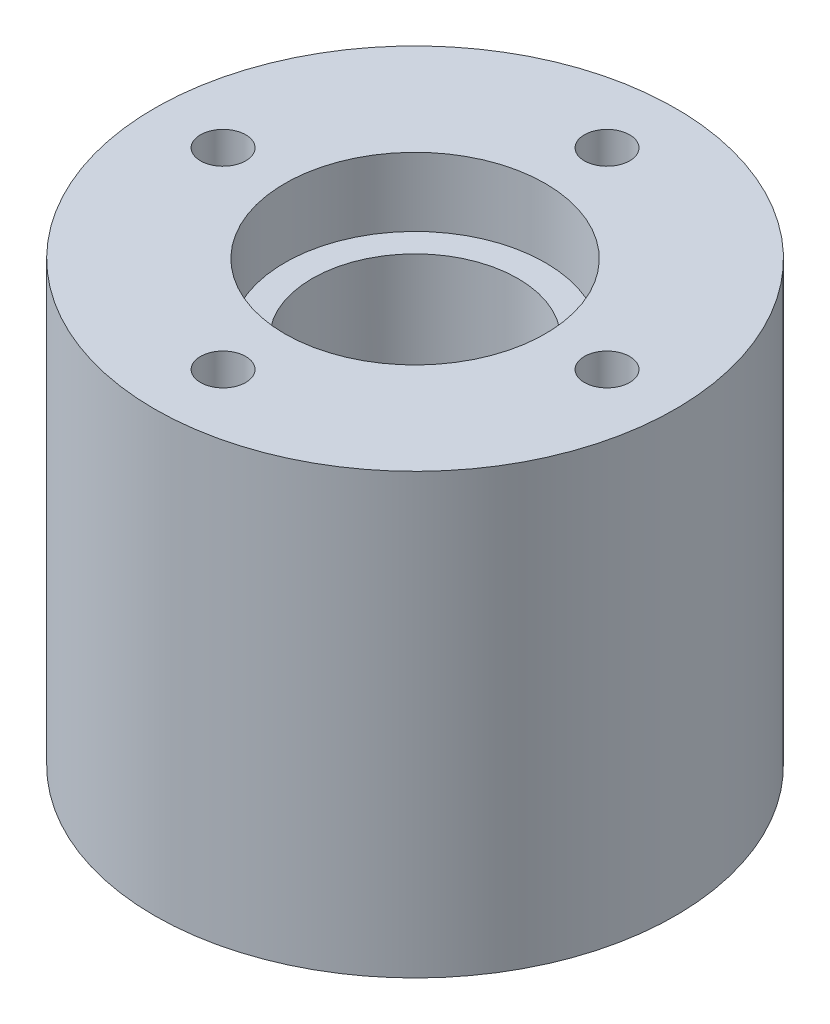
ISO-10303-21;
HEADER;
FILE_DESCRIPTION(('STEP AP214'),'2;1');
FILE_NAME('part.step','',(''),(''),'','','');
FILE_SCHEMA(('AUTOMOTIVE_DESIGN { 1 0 10303 214 1 1 1 1 }'));
ENDSEC;
DATA;
#1=APPLICATION_CONTEXT('core data for automotive mechanical design processes');
#2=APPLICATION_PROTOCOL_DEFINITION('international standard','automotive_design',2000,#1);
#3=PRODUCT_CONTEXT('',#1,'mechanical');
#4=PRODUCT('Part','Part','',(#3));
#5=PRODUCT_RELATED_PRODUCT_CATEGORY('part','',(#4));
#6=PRODUCT_DEFINITION_FORMATION('','',#4);
#7=PRODUCT_DEFINITION_CONTEXT('part definition',#1,'design');
#8=PRODUCT_DEFINITION('design','',#6,#7);
#9=PRODUCT_DEFINITION_SHAPE('','',#8);
#10=(LENGTH_UNIT() NAMED_UNIT(*) SI_UNIT(.MILLI.,.METRE.));
#11=(NAMED_UNIT(*) PLANE_ANGLE_UNIT() SI_UNIT($,.RADIAN.));
#12=(NAMED_UNIT(*) SI_UNIT($,.STERADIAN.) SOLID_ANGLE_UNIT());
#13=UNCERTAINTY_MEASURE_WITH_UNIT(LENGTH_MEASURE(1.E-05),#10,'distance_accuracy_value','');
#14=(GEOMETRIC_REPRESENTATION_CONTEXT(3) GLOBAL_UNCERTAINTY_ASSIGNED_CONTEXT((#13)) GLOBAL_UNIT_ASSIGNED_CONTEXT((#10,
#11,#12)) REPRESENTATION_CONTEXT('',''));
#15=CARTESIAN_POINT('',(0.,0.,0.));
#16=DIRECTION('',(0.,0.,1.));
#17=DIRECTION('',(1.,0.,0.));
#18=AXIS2_PLACEMENT_3D('',#15,#16,#17);
#19=CARTESIAN_POINT('',(0.,32.,0.));
#20=DIRECTION('',(0.,-1.,0.));
#21=DIRECTION('',(0.,0.,-1.));
#22=AXIS2_PLACEMENT_3D('',#19,#20,#21);
#23=CYLINDRICAL_SURFACE('',#22,7.5);
#24=CARTESIAN_POINT('',(0.,27.,0.));
#25=DIRECTION('',(0.,1.,0.));
#26=DIRECTION('',(0.,0.,1.));
#27=AXIS2_PLACEMENT_3D('',#24,#25,#26);
#28=CIRCLE('',#27,7.5);
#29=CARTESIAN_POINT('',(0.,27.,7.5));
#30=VERTEX_POINT('',#29);
#31=EDGE_CURVE('E137',#30,#30,#28,.T.);
#32=ORIENTED_EDGE('',*,*,#31,.T.);
#33=EDGE_LOOP('',(#32));
#34=FACE_BOUND('',#33,.T.);
#35=CARTESIAN_POINT('',(0.,5.,0.));
#36=DIRECTION('',(0.,-1.,0.));
#37=DIRECTION('',(0.,0.,-1.));
#38=AXIS2_PLACEMENT_3D('',#35,#36,#37);
#39=CIRCLE('',#38,7.5);
#40=CARTESIAN_POINT('',(0.,5.,-7.5));
#41=VERTEX_POINT('',#40);
#42=EDGE_CURVE('E40',#41,#41,#39,.T.);
#43=ORIENTED_EDGE('',*,*,#42,.T.);
#44=EDGE_LOOP('',(#43));
#45=FACE_BOUND('',#44,.T.);
#46=ADVANCED_FACE('F36',(#34,#45),#23,.F.);
#47=CARTESIAN_POINT('',(0.,32.,0.));
#48=DIRECTION('',(0.,1.,0.));
#49=DIRECTION('',(0.,0.,1.));
#50=AXIS2_PLACEMENT_3D('',#47,#48,#49);
#51=PLANE('',#50);
#52=CARTESIAN_POINT('',(14.,32.,0.));
#53=DIRECTION('',(0.,1.,0.));
#54=DIRECTION('',(0.,0.,1.));
#55=AXIS2_PLACEMENT_3D('',#52,#53,#54);
#56=CIRCLE('',#55,1.64999999999999);
#57=CARTESIAN_POINT('',(14.,32.,1.64999999999999));
#58=VERTEX_POINT('',#57);
#59=EDGE_CURVE('E82',#58,#58,#56,.T.);
#60=ORIENTED_EDGE('',*,*,#59,.F.);
#61=EDGE_LOOP('',(#60));
#62=FACE_BOUND('',#61,.T.);
#63=CARTESIAN_POINT('',(0.,32.,14.));
#64=DIRECTION('',(0.,1.,0.));
#65=DIRECTION('',(0.,0.,1.));
#66=AXIS2_PLACEMENT_3D('',#63,#64,#65);
#67=CIRCLE('',#66,1.64999999999999);
#68=CARTESIAN_POINT('',(0.,32.,15.65));
#69=VERTEX_POINT('',#68);
#70=EDGE_CURVE('E81',#69,#69,#67,.T.);
#71=ORIENTED_EDGE('',*,*,#70,.F.);
#72=EDGE_LOOP('',(#71));
#73=FACE_BOUND('',#72,.T.);
#74=CARTESIAN_POINT('',(-14.,32.,0.));
#75=DIRECTION('',(0.,1.,0.));
#76=DIRECTION('',(0.,0.,1.));
#77=AXIS2_PLACEMENT_3D('',#74,#75,#76);
#78=CIRCLE('',#77,1.64999999999999);
#79=CARTESIAN_POINT('',(-14.,32.,1.64999999999999));
#80=VERTEX_POINT('',#79);
#81=EDGE_CURVE('E92',#80,#80,#78,.T.);
#82=ORIENTED_EDGE('',*,*,#81,.F.);
#83=EDGE_LOOP('',(#82));
#84=FACE_BOUND('',#83,.T.);
#85=CARTESIAN_POINT('',(0.,32.,-14.));
#86=DIRECTION('',(0.,1.,0.));
#87=DIRECTION('',(0.,0.,1.));
#88=AXIS2_PLACEMENT_3D('',#85,#86,#87);
#89=CIRCLE('',#88,1.64999999999999);
#90=CARTESIAN_POINT('',(0.,32.,-12.35));
#91=VERTEX_POINT('',#90);
#92=EDGE_CURVE('E98',#91,#91,#89,.T.);
#93=ORIENTED_EDGE('',*,*,#92,.F.);
#94=EDGE_LOOP('',(#93));
#95=FACE_BOUND('',#94,.T.);
#96=CARTESIAN_POINT('',(0.,32.,0.));
#97=DIRECTION('',(0.,1.,0.));
#98=DIRECTION('',(0.,0.,1.));
#99=AXIS2_PLACEMENT_3D('',#96,#97,#98);
#100=CIRCLE('',#99,9.5);
#101=CARTESIAN_POINT('',(0.,32.,9.5));
#102=VERTEX_POINT('',#101);
#103=EDGE_CURVE('E138',#102,#102,#100,.T.);
#104=ORIENTED_EDGE('',*,*,#103,.F.);
#105=EDGE_LOOP('',(#104));
#106=FACE_BOUND('',#105,.T.);
#107=CARTESIAN_POINT('',(0.,32.,0.));
#108=DIRECTION('',(0.,1.,0.));
#109=DIRECTION('',(0.,0.,1.));
#110=AXIS2_PLACEMENT_3D('',#107,#108,#109);
#111=CIRCLE('',#110,19.);
#112=CARTESIAN_POINT('',(0.,32.,19.));
#113=VERTEX_POINT('',#112);
#114=EDGE_CURVE('E11',#113,#113,#111,.T.);
#115=ORIENTED_EDGE('',*,*,#114,.T.);
#116=EDGE_LOOP('',(#115));
#117=FACE_BOUND('',#116,.T.);
#118=ADVANCED_FACE('F160',(#62,#73,#84,#95,#106,#117),#51,.T.);
#119=CARTESIAN_POINT('',(0.,0.,0.));
#120=DIRECTION('',(0.,1.,0.));
#121=DIRECTION('',(0.,0.,1.));
#122=AXIS2_PLACEMENT_3D('',#119,#120,#121);
#123=PLANE('',#122);
#124=CARTESIAN_POINT('',(0.,0.,-14.));
#125=DIRECTION('',(0.,-1.,0.));
#126=DIRECTION('',(0.,0.,-1.));
#127=AXIS2_PLACEMENT_3D('',#124,#125,#126);
#128=CIRCLE('',#127,1.65);
#129=CARTESIAN_POINT('',(0.,0.,-15.65));
#130=VERTEX_POINT('',#129);
#131=EDGE_CURVE('E104',#130,#130,#128,.T.);
#132=ORIENTED_EDGE('',*,*,#131,.F.);
#133=EDGE_LOOP('',(#132));
#134=FACE_BOUND('',#133,.T.);
#135=CARTESIAN_POINT('',(-14.,0.,0.));
#136=DIRECTION('',(0.,-1.,0.));
#137=DIRECTION('',(0.,0.,-1.));
#138=AXIS2_PLACEMENT_3D('',#135,#136,#137);
#139=CIRCLE('',#138,1.65);
#140=CARTESIAN_POINT('',(-14.,0.,-1.65));
#141=VERTEX_POINT('',#140);
#142=EDGE_CURVE('E110',#141,#141,#139,.T.);
#143=ORIENTED_EDGE('',*,*,#142,.F.);
#144=EDGE_LOOP('',(#143));
#145=FACE_BOUND('',#144,.T.);
#146=CARTESIAN_POINT('',(0.,0.,14.));
#147=DIRECTION('',(0.,-1.,0.));
#148=DIRECTION('',(0.,0.,-1.));
#149=AXIS2_PLACEMENT_3D('',#146,#147,#148);
#150=CIRCLE('',#149,1.65);
#151=CARTESIAN_POINT('',(0.,0.,12.35));
#152=VERTEX_POINT('',#151);
#153=EDGE_CURVE('E116',#152,#152,#150,.T.);
#154=ORIENTED_EDGE('',*,*,#153,.F.);
#155=EDGE_LOOP('',(#154));
#156=FACE_BOUND('',#155,.T.);
#157=CARTESIAN_POINT('',(14.,0.,0.));
#158=DIRECTION('',(0.,-1.,0.));
#159=DIRECTION('',(0.,0.,-1.));
#160=AXIS2_PLACEMENT_3D('',#157,#158,#159);
#161=CIRCLE('',#160,1.65);
#162=CARTESIAN_POINT('',(14.,0.,-1.65));
#163=VERTEX_POINT('',#162);
#164=EDGE_CURVE('E122',#163,#163,#161,.T.);
#165=ORIENTED_EDGE('',*,*,#164,.F.);
#166=EDGE_LOOP('',(#165));
#167=FACE_BOUND('',#166,.T.);
#168=CARTESIAN_POINT('',(0.,0.,0.));
#169=DIRECTION('',(0.,-1.,0.));
#170=DIRECTION('',(0.,0.,-1.));
#171=AXIS2_PLACEMENT_3D('',#168,#169,#170);
#172=CIRCLE('',#171,9.5);
#173=CARTESIAN_POINT('',(0.,0.,-9.5));
#174=VERTEX_POINT('',#173);
#175=EDGE_CURVE('E128',#174,#174,#172,.T.);
#176=ORIENTED_EDGE('',*,*,#175,.F.);
#177=EDGE_LOOP('',(#176));
#178=FACE_BOUND('',#177,.T.);
#179=CARTESIAN_POINT('',(0.,0.,0.));
#180=DIRECTION('',(0.,1.,0.));
#181=DIRECTION('',(0.,0.,1.));
#182=AXIS2_PLACEMENT_3D('',#179,#180,#181);
#183=CIRCLE('',#182,19.);
#184=CARTESIAN_POINT('',(0.,0.,19.));
#185=VERTEX_POINT('',#184);
#186=EDGE_CURVE('E45',#185,#185,#183,.T.);
#187=ORIENTED_EDGE('',*,*,#186,.F.);
#188=EDGE_LOOP('',(#187));
#189=FACE_BOUND('',#188,.T.);
#190=ADVANCED_FACE('F163',(#134,#145,#156,#167,#178,#189),#123,.F.);
#191=CARTESIAN_POINT('',(0.,32.,0.));
#192=DIRECTION('',(0.,-1.,0.));
#193=DIRECTION('',(0.,0.,-1.));
#194=AXIS2_PLACEMENT_3D('',#191,#192,#193);
#195=CYLINDRICAL_SURFACE('',#194,19.);
#196=ORIENTED_EDGE('',*,*,#114,.F.);
#197=EDGE_LOOP('',(#196));
#198=FACE_BOUND('',#197,.T.);
#199=ORIENTED_EDGE('',*,*,#186,.T.);
#200=EDGE_LOOP('',(#199));
#201=FACE_BOUND('',#200,.T.);
#202=ADVANCED_FACE('F38',(#198,#201),#195,.T.);
#203=CARTESIAN_POINT('',(0.,27.,0.));
#204=DIRECTION('',(0.,1.,0.));
#205=DIRECTION('',(0.,0.,1.));
#206=AXIS2_PLACEMENT_3D('',#203,#204,#205);
#207=CYLINDRICAL_SURFACE('',#206,9.5);
#208=CARTESIAN_POINT('',(0.,27.,0.));
#209=DIRECTION('',(0.,1.,0.));
#210=DIRECTION('',(0.,0.,1.));
#211=AXIS2_PLACEMENT_3D('',#208,#209,#210);
#212=CIRCLE('',#211,9.5);
#213=CARTESIAN_POINT('',(0.,27.,9.5));
#214=VERTEX_POINT('',#213);
#215=EDGE_CURVE('E134',#214,#214,#212,.T.);
#216=ORIENTED_EDGE('',*,*,#215,.F.);
#217=EDGE_LOOP('',(#216));
#218=FACE_BOUND('',#217,.T.);
#219=ORIENTED_EDGE('',*,*,#103,.T.);
#220=EDGE_LOOP('',(#219));
#221=FACE_BOUND('',#220,.T.);
#222=ADVANCED_FACE('F151',(#218,#221),#207,.F.);
#223=CARTESIAN_POINT('',(0.,27.,0.));
#224=DIRECTION('',(0.,1.,0.));
#225=DIRECTION('',(0.,0.,1.));
#226=AXIS2_PLACEMENT_3D('',#223,#224,#225);
#227=PLANE('',#226);
#228=ORIENTED_EDGE('',*,*,#31,.F.);
#229=EDGE_LOOP('',(#228));
#230=FACE_BOUND('',#229,.T.);
#231=ORIENTED_EDGE('',*,*,#215,.T.);
#232=EDGE_LOOP('',(#231));
#233=FACE_BOUND('',#232,.T.);
#234=ADVANCED_FACE('F147',(#230,#233),#227,.T.);
#235=CARTESIAN_POINT('',(0.,5.,0.));
#236=DIRECTION('',(0.,-1.,0.));
#237=DIRECTION('',(0.,0.,-1.));
#238=AXIS2_PLACEMENT_3D('',#235,#236,#237);
#239=CYLINDRICAL_SURFACE('',#238,9.5);
#240=CARTESIAN_POINT('',(0.,5.,0.));
#241=DIRECTION('',(0.,-1.,0.));
#242=DIRECTION('',(0.,0.,-1.));
#243=AXIS2_PLACEMENT_3D('',#240,#241,#242);
#244=CIRCLE('',#243,9.5);
#245=CARTESIAN_POINT('',(0.,5.,-9.5));
#246=VERTEX_POINT('',#245);
#247=EDGE_CURVE('E129',#246,#246,#244,.T.);
#248=ORIENTED_EDGE('',*,*,#247,.F.);
#249=EDGE_LOOP('',(#248));
#250=FACE_BOUND('',#249,.T.);
#251=ORIENTED_EDGE('',*,*,#175,.T.);
#252=EDGE_LOOP('',(#251));
#253=FACE_BOUND('',#252,.T.);
#254=ADVANCED_FACE('F150',(#250,#253),#239,.F.);
#255=CARTESIAN_POINT('',(0.,5.,0.));
#256=DIRECTION('',(0.,-1.,0.));
#257=DIRECTION('',(0.,0.,-1.));
#258=AXIS2_PLACEMENT_3D('',#255,#256,#257);
#259=PLANE('',#258);
#260=ORIENTED_EDGE('',*,*,#42,.F.);
#261=EDGE_LOOP('',(#260));
#262=FACE_BOUND('',#261,.T.);
#263=ORIENTED_EDGE('',*,*,#247,.T.);
#264=EDGE_LOOP('',(#263));
#265=FACE_BOUND('',#264,.T.);
#266=ADVANCED_FACE('F188',(#262,#265),#259,.T.);
#267=CARTESIAN_POINT('',(14.,10.1,0.));
#268=DIRECTION('',(0.,-1.,0.));
#269=DIRECTION('',(0.,0.,-1.));
#270=AXIS2_PLACEMENT_3D('',#267,#268,#269);
#271=CONICAL_SURFACE('',#270,1.65,1.02974425867665);
#272=CARTESIAN_POINT('',(14.,11.0914200213955,0.));
#273=VERTEX_POINT('',#272);
#274=VERTEX_LOOP('',#273);
#275=FACE_BOUND('',#274,.T.);
#276=CARTESIAN_POINT('',(14.,10.1,0.));
#277=DIRECTION('',(0.,-1.,0.));
#278=DIRECTION('',(0.,0.,-1.));
#279=AXIS2_PLACEMENT_3D('',#276,#277,#278);
#280=CIRCLE('',#279,1.65);
#281=CARTESIAN_POINT('',(14.,10.1,-1.65));
#282=VERTEX_POINT('',#281);
#283=EDGE_CURVE('E125',#282,#282,#280,.T.);
#284=ORIENTED_EDGE('',*,*,#283,.T.);
#285=EDGE_LOOP('',(#284));
#286=FACE_BOUND('',#285,.T.);
#287=ADVANCED_FACE('F192',(#275,#286),#271,.F.);
#288=CARTESIAN_POINT('',(14.,0.,0.));
#289=DIRECTION('',(0.,-1.,0.));
#290=DIRECTION('',(0.,0.,-1.));
#291=AXIS2_PLACEMENT_3D('',#288,#289,#290);
#292=CYLINDRICAL_SURFACE('',#291,1.65);
#293=ORIENTED_EDGE('',*,*,#283,.F.);
#294=EDGE_LOOP('',(#293));
#295=FACE_BOUND('',#294,.T.);
#296=ORIENTED_EDGE('',*,*,#164,.T.);
#297=EDGE_LOOP('',(#296));
#298=FACE_BOUND('',#297,.T.);
#299=ADVANCED_FACE('F196',(#295,#298),#292,.F.);
#300=CARTESIAN_POINT('',(0.,10.1,14.));
#301=DIRECTION('',(0.,-1.,0.));
#302=DIRECTION('',(0.,0.,-1.));
#303=AXIS2_PLACEMENT_3D('',#300,#301,#302);
#304=CONICAL_SURFACE('',#303,1.65,1.02974425867665);
#305=CARTESIAN_POINT('',(0.,11.0914200213955,14.));
#306=VERTEX_POINT('',#305);
#307=VERTEX_LOOP('',#306);
#308=FACE_BOUND('',#307,.T.);
#309=CARTESIAN_POINT('',(0.,10.1,14.));
#310=DIRECTION('',(0.,-1.,0.));
#311=DIRECTION('',(0.,0.,-1.));
#312=AXIS2_PLACEMENT_3D('',#309,#310,#311);
#313=CIRCLE('',#312,1.65);
#314=CARTESIAN_POINT('',(0.,10.1,12.35));
#315=VERTEX_POINT('',#314);
#316=EDGE_CURVE('E119',#315,#315,#313,.T.);
#317=ORIENTED_EDGE('',*,*,#316,.T.);
#318=EDGE_LOOP('',(#317));
#319=FACE_BOUND('',#318,.T.);
#320=ADVANCED_FACE('F199',(#308,#319),#304,.F.);
#321=CARTESIAN_POINT('',(0.,0.,14.));
#322=DIRECTION('',(0.,-1.,0.));
#323=DIRECTION('',(0.,0.,-1.));
#324=AXIS2_PLACEMENT_3D('',#321,#322,#323);
#325=CYLINDRICAL_SURFACE('',#324,1.65);
#326=ORIENTED_EDGE('',*,*,#316,.F.);
#327=EDGE_LOOP('',(#326));
#328=FACE_BOUND('',#327,.T.);
#329=ORIENTED_EDGE('',*,*,#153,.T.);
#330=EDGE_LOOP('',(#329));
#331=FACE_BOUND('',#330,.T.);
#332=ADVANCED_FACE('F203',(#328,#331),#325,.F.);
#333=CARTESIAN_POINT('',(-14.,10.1,0.));
#334=DIRECTION('',(0.,-1.,0.));
#335=DIRECTION('',(0.,0.,-1.));
#336=AXIS2_PLACEMENT_3D('',#333,#334,#335);
#337=CONICAL_SURFACE('',#336,1.65,1.02974425867665);
#338=CARTESIAN_POINT('',(-14.,11.0914200213955,0.));
#339=VERTEX_POINT('',#338);
#340=VERTEX_LOOP('',#339);
#341=FACE_BOUND('',#340,.T.);
#342=CARTESIAN_POINT('',(-14.,10.1,0.));
#343=DIRECTION('',(0.,-1.,0.));
#344=DIRECTION('',(0.,0.,-1.));
#345=AXIS2_PLACEMENT_3D('',#342,#343,#344);
#346=CIRCLE('',#345,1.65);
#347=CARTESIAN_POINT('',(-14.,10.1,-1.65));
#348=VERTEX_POINT('',#347);
#349=EDGE_CURVE('E113',#348,#348,#346,.T.);
#350=ORIENTED_EDGE('',*,*,#349,.T.);
#351=EDGE_LOOP('',(#350));
#352=FACE_BOUND('',#351,.T.);
#353=ADVANCED_FACE('F206',(#341,#352),#337,.F.);
#354=CARTESIAN_POINT('',(-14.,0.,0.));
#355=DIRECTION('',(0.,-1.,0.));
#356=DIRECTION('',(0.,0.,-1.));
#357=AXIS2_PLACEMENT_3D('',#354,#355,#356);
#358=CYLINDRICAL_SURFACE('',#357,1.65);
#359=ORIENTED_EDGE('',*,*,#349,.F.);
#360=EDGE_LOOP('',(#359));
#361=FACE_BOUND('',#360,.T.);
#362=ORIENTED_EDGE('',*,*,#142,.T.);
#363=EDGE_LOOP('',(#362));
#364=FACE_BOUND('',#363,.T.);
#365=ADVANCED_FACE('F210',(#361,#364),#358,.F.);
#366=CARTESIAN_POINT('',(0.,10.1,-14.));
#367=DIRECTION('',(0.,-1.,0.));
#368=DIRECTION('',(0.,0.,-1.));
#369=AXIS2_PLACEMENT_3D('',#366,#367,#368);
#370=CONICAL_SURFACE('',#369,1.65,1.02974425867665);
#371=CARTESIAN_POINT('',(0.,11.0914200213955,-14.));
#372=VERTEX_POINT('',#371);
#373=VERTEX_LOOP('',#372);
#374=FACE_BOUND('',#373,.T.);
#375=CARTESIAN_POINT('',(0.,10.1,-14.));
#376=DIRECTION('',(0.,-1.,0.));
#377=DIRECTION('',(0.,0.,-1.));
#378=AXIS2_PLACEMENT_3D('',#375,#376,#377);
#379=CIRCLE('',#378,1.65);
#380=CARTESIAN_POINT('',(0.,10.1,-15.65));
#381=VERTEX_POINT('',#380);
#382=EDGE_CURVE('E107',#381,#381,#379,.T.);
#383=ORIENTED_EDGE('',*,*,#382,.T.);
#384=EDGE_LOOP('',(#383));
#385=FACE_BOUND('',#384,.T.);
#386=ADVANCED_FACE('F214',(#374,#385),#370,.F.);
#387=CARTESIAN_POINT('',(0.,0.,-14.));
#388=DIRECTION('',(0.,-1.,0.));
#389=DIRECTION('',(0.,0.,-1.));
#390=AXIS2_PLACEMENT_3D('',#387,#388,#389);
#391=CYLINDRICAL_SURFACE('',#390,1.65);
#392=ORIENTED_EDGE('',*,*,#382,.F.);
#393=EDGE_LOOP('',(#392));
#394=FACE_BOUND('',#393,.T.);
#395=ORIENTED_EDGE('',*,*,#131,.T.);
#396=EDGE_LOOP('',(#395));
#397=FACE_BOUND('',#396,.T.);
#398=ADVANCED_FACE('F218',(#394,#397),#391,.F.);
#399=CARTESIAN_POINT('',(0.,21.9,-14.));
#400=DIRECTION('',(0.,1.,0.));
#401=DIRECTION('',(0.,0.,1.));
#402=AXIS2_PLACEMENT_3D('',#399,#400,#401);
#403=CONICAL_SURFACE('',#402,1.64999999999999,1.02974425867665);
#404=CARTESIAN_POINT('',(0.,20.9085799786045,-14.));
#405=VERTEX_POINT('',#404);
#406=VERTEX_LOOP('',#405);
#407=FACE_BOUND('',#406,.T.);
#408=CARTESIAN_POINT('',(0.,21.9,-14.));
#409=DIRECTION('',(0.,1.,0.));
#410=DIRECTION('',(0.,0.,1.));
#411=AXIS2_PLACEMENT_3D('',#408,#409,#410);
#412=CIRCLE('',#411,1.64999999999999);
#413=CARTESIAN_POINT('',(0.,21.9,-12.35));
#414=VERTEX_POINT('',#413);
#415=EDGE_CURVE('E101',#414,#414,#412,.T.);
#416=ORIENTED_EDGE('',*,*,#415,.T.);
#417=EDGE_LOOP('',(#416));
#418=FACE_BOUND('',#417,.T.);
#419=ADVANCED_FACE('F222',(#407,#418),#403,.F.);
#420=CARTESIAN_POINT('',(0.,32.,-14.));
#421=DIRECTION('',(0.,1.,0.));
#422=DIRECTION('',(0.,0.,1.));
#423=AXIS2_PLACEMENT_3D('',#420,#421,#422);
#424=CYLINDRICAL_SURFACE('',#423,1.64999999999999);
#425=ORIENTED_EDGE('',*,*,#415,.F.);
#426=EDGE_LOOP('',(#425));
#427=FACE_BOUND('',#426,.T.);
#428=ORIENTED_EDGE('',*,*,#92,.T.);
#429=EDGE_LOOP('',(#428));
#430=FACE_BOUND('',#429,.T.);
#431=ADVANCED_FACE('F226',(#427,#430),#424,.F.);
#432=CARTESIAN_POINT('',(-14.,21.9,0.));
#433=DIRECTION('',(0.,1.,0.));
#434=DIRECTION('',(0.,0.,1.));
#435=AXIS2_PLACEMENT_3D('',#432,#433,#434);
#436=CONICAL_SURFACE('',#435,1.64999999999999,1.02974425867665);
#437=CARTESIAN_POINT('',(-14.,20.9085799786045,0.));
#438=VERTEX_POINT('',#437);
#439=VERTEX_LOOP('',#438);
#440=FACE_BOUND('',#439,.T.);
#441=CARTESIAN_POINT('',(-14.,21.9,0.));
#442=DIRECTION('',(0.,1.,0.));
#443=DIRECTION('',(0.,0.,1.));
#444=AXIS2_PLACEMENT_3D('',#441,#442,#443);
#445=CIRCLE('',#444,1.64999999999999);
#446=CARTESIAN_POINT('',(-14.,21.9,1.64999999999999));
#447=VERTEX_POINT('',#446);
#448=EDGE_CURVE('E95',#447,#447,#445,.T.);
#449=ORIENTED_EDGE('',*,*,#448,.T.);
#450=EDGE_LOOP('',(#449));
#451=FACE_BOUND('',#450,.T.);
#452=ADVANCED_FACE('F230',(#440,#451),#436,.F.);
#453=CARTESIAN_POINT('',(-14.,32.,0.));
#454=DIRECTION('',(0.,1.,0.));
#455=DIRECTION('',(0.,0.,1.));
#456=AXIS2_PLACEMENT_3D('',#453,#454,#455);
#457=CYLINDRICAL_SURFACE('',#456,1.64999999999999);
#458=ORIENTED_EDGE('',*,*,#448,.F.);
#459=EDGE_LOOP('',(#458));
#460=FACE_BOUND('',#459,.T.);
#461=ORIENTED_EDGE('',*,*,#81,.T.);
#462=EDGE_LOOP('',(#461));
#463=FACE_BOUND('',#462,.T.);
#464=ADVANCED_FACE('F234',(#460,#463),#457,.F.);
#465=CARTESIAN_POINT('',(0.,21.9,14.));
#466=DIRECTION('',(0.,1.,0.));
#467=DIRECTION('',(0.,0.,1.));
#468=AXIS2_PLACEMENT_3D('',#465,#466,#467);
#469=CONICAL_SURFACE('',#468,1.64999999999999,1.02974425867665);
#470=CARTESIAN_POINT('',(0.,20.9085799786045,14.));
#471=VERTEX_POINT('',#470);
#472=VERTEX_LOOP('',#471);
#473=FACE_BOUND('',#472,.T.);
#474=CARTESIAN_POINT('',(0.,21.9,14.));
#475=DIRECTION('',(0.,1.,0.));
#476=DIRECTION('',(0.,0.,1.));
#477=AXIS2_PLACEMENT_3D('',#474,#475,#476);
#478=CIRCLE('',#477,1.64999999999999);
#479=CARTESIAN_POINT('',(0.,21.9,15.65));
#480=VERTEX_POINT('',#479);
#481=EDGE_CURVE('E85',#480,#480,#478,.T.);
#482=ORIENTED_EDGE('',*,*,#481,.T.);
#483=EDGE_LOOP('',(#482));
#484=FACE_BOUND('',#483,.T.);
#485=ADVANCED_FACE('F238',(#473,#484),#469,.F.);
#486=CARTESIAN_POINT('',(0.,32.,14.));
#487=DIRECTION('',(0.,1.,0.));
#488=DIRECTION('',(0.,0.,1.));
#489=AXIS2_PLACEMENT_3D('',#486,#487,#488);
#490=CYLINDRICAL_SURFACE('',#489,1.64999999999999);
#491=ORIENTED_EDGE('',*,*,#481,.F.);
#492=EDGE_LOOP('',(#491));
#493=FACE_BOUND('',#492,.T.);
#494=ORIENTED_EDGE('',*,*,#70,.T.);
#495=EDGE_LOOP('',(#494));
#496=FACE_BOUND('',#495,.T.);
#497=ADVANCED_FACE('F75',(#493,#496),#490,.F.);
#498=CARTESIAN_POINT('',(14.,21.9,0.));
#499=DIRECTION('',(0.,1.,0.));
#500=DIRECTION('',(0.,0.,1.));
#501=AXIS2_PLACEMENT_3D('',#498,#499,#500);
#502=CONICAL_SURFACE('',#501,1.64999999999999,1.02974425867665);
#503=CARTESIAN_POINT('',(14.,20.9085799786045,0.));
#504=VERTEX_POINT('',#503);
#505=VERTEX_LOOP('',#504);
#506=FACE_BOUND('',#505,.T.);
#507=CARTESIAN_POINT('',(14.,21.9,0.));
#508=DIRECTION('',(0.,1.,0.));
#509=DIRECTION('',(0.,0.,1.));
#510=AXIS2_PLACEMENT_3D('',#507,#508,#509);
#511=CIRCLE('',#510,1.64999999999999);
#512=CARTESIAN_POINT('',(14.,21.9,1.64999999999999));
#513=VERTEX_POINT('',#512);
#514=EDGE_CURVE('E79',#513,#513,#511,.T.);
#515=ORIENTED_EDGE('',*,*,#514,.T.);
#516=EDGE_LOOP('',(#515));
#517=FACE_BOUND('',#516,.T.);
#518=ADVANCED_FACE('F71',(#506,#517),#502,.F.);
#519=CARTESIAN_POINT('',(14.,32.,0.));
#520=DIRECTION('',(0.,1.,0.));
#521=DIRECTION('',(0.,0.,1.));
#522=AXIS2_PLACEMENT_3D('',#519,#520,#521);
#523=CYLINDRICAL_SURFACE('',#522,1.64999999999999);
#524=ORIENTED_EDGE('',*,*,#514,.F.);
#525=EDGE_LOOP('',(#524));
#526=FACE_BOUND('',#525,.T.);
#527=ORIENTED_EDGE('',*,*,#59,.T.);
#528=EDGE_LOOP('',(#527));
#529=FACE_BOUND('',#528,.T.);
#530=ADVANCED_FACE('F74',(#526,#529),#523,.F.);
#531=CLOSED_SHELL('',(#46,#118,#190,#202,#222,#234,#254,#266,#287,#299,#320,#332,#353,#365,#386,
#398,#419,#431,#452,#464,#485,#497,#518,#530));
#532=MANIFOLD_SOLID_BREP('B2',#531);
#533=ADVANCED_BREP_SHAPE_REPRESENTATION('',(#18,#532),#14);
#534=SHAPE_DEFINITION_REPRESENTATION(#9,#533);
ENDSEC;
END-ISO-10303-21;
